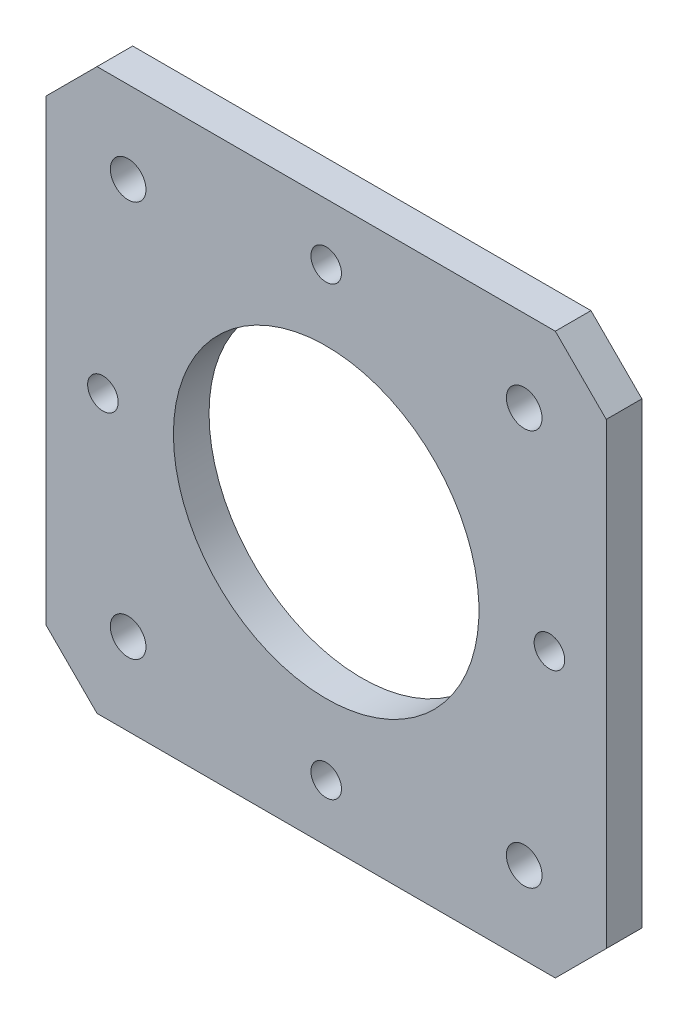
ISO-10303-21;
HEADER;
FILE_DESCRIPTION(('STEP AP214'),'2;1');
FILE_NAME('part.step','',(''),(''),'','','');
FILE_SCHEMA(('AUTOMOTIVE_DESIGN { 1 0 10303 214 1 1 1 1 }'));
ENDSEC;
DATA;
#1=APPLICATION_CONTEXT('core data for automotive mechanical design processes');
#2=APPLICATION_PROTOCOL_DEFINITION('international standard','automotive_design',2000,#1);
#3=PRODUCT_CONTEXT('',#1,'mechanical');
#4=PRODUCT('Part','Part','',(#3));
#5=PRODUCT_RELATED_PRODUCT_CATEGORY('part','',(#4));
#6=PRODUCT_DEFINITION_FORMATION('','',#4);
#7=PRODUCT_DEFINITION_CONTEXT('part definition',#1,'design');
#8=PRODUCT_DEFINITION('design','',#6,#7);
#9=PRODUCT_DEFINITION_SHAPE('','',#8);
#10=(LENGTH_UNIT() NAMED_UNIT(*) SI_UNIT(.MILLI.,.METRE.));
#11=(NAMED_UNIT(*) PLANE_ANGLE_UNIT() SI_UNIT($,.RADIAN.));
#12=(NAMED_UNIT(*) SI_UNIT($,.STERADIAN.) SOLID_ANGLE_UNIT());
#13=UNCERTAINTY_MEASURE_WITH_UNIT(LENGTH_MEASURE(1.E-05),#10,'distance_accuracy_value','');
#14=(GEOMETRIC_REPRESENTATION_CONTEXT(3) GLOBAL_UNCERTAINTY_ASSIGNED_CONTEXT((#13)) GLOBAL_UNIT_ASSIGNED_CONTEXT((#10,
#11,#12)) REPRESENTATION_CONTEXT('',''));
#15=CARTESIAN_POINT('',(0.,0.,0.));
#16=DIRECTION('',(0.,0.,1.));
#17=DIRECTION('',(1.,0.,0.));
#18=AXIS2_PLACEMENT_3D('',#15,#16,#17);
#19=CARTESIAN_POINT('',(0.,0.,3.5));
#20=DIRECTION('',(0.,0.,1.));
#21=DIRECTION('',(1.,0.,0.));
#22=AXIS2_PLACEMENT_3D('',#19,#20,#21);
#23=PLANE('',#22);
#24=CARTESIAN_POINT('',(0.,21.920310216783,3.5));
#25=DIRECTION('',(0.,0.,-1.));
#26=DIRECTION('',(-1.,0.,0.));
#27=AXIS2_PLACEMENT_3D('',#24,#25,#26);
#28=CIRCLE('',#27,1.5);
#29=CARTESIAN_POINT('',(-1.5,21.920310216783,3.5));
#30=VERTEX_POINT('',#29);
#31=EDGE_CURVE('E237',#30,#30,#28,.T.);
#32=ORIENTED_EDGE('',*,*,#31,.T.);
#33=EDGE_LOOP('',(#32));
#34=FACE_BOUND('',#33,.T.);
#35=CARTESIAN_POINT('',(21.920310216783,0.,3.5));
#36=DIRECTION('',(0.,0.,-1.));
#37=DIRECTION('',(-1.,0.,0.));
#38=AXIS2_PLACEMENT_3D('',#35,#36,#37);
#39=CIRCLE('',#38,1.5);
#40=CARTESIAN_POINT('',(20.420310216783,0.,3.5));
#41=VERTEX_POINT('',#40);
#42=EDGE_CURVE('E257',#41,#41,#39,.T.);
#43=ORIENTED_EDGE('',*,*,#42,.T.);
#44=EDGE_LOOP('',(#43));
#45=FACE_BOUND('',#44,.T.);
#46=CARTESIAN_POINT('',(0.,-21.920310216783,3.5));
#47=DIRECTION('',(0.,0.,-1.));
#48=DIRECTION('',(-1.,0.,0.));
#49=AXIS2_PLACEMENT_3D('',#46,#47,#48);
#50=CIRCLE('',#49,1.5);
#51=CARTESIAN_POINT('',(-1.5,-21.920310216783,3.5));
#52=VERTEX_POINT('',#51);
#53=EDGE_CURVE('E249',#52,#52,#50,.T.);
#54=ORIENTED_EDGE('',*,*,#53,.T.);
#55=EDGE_LOOP('',(#54));
#56=FACE_BOUND('',#55,.T.);
#57=CARTESIAN_POINT('',(-21.920310216783,0.,3.5));
#58=DIRECTION('',(0.,0.,-1.));
#59=DIRECTION('',(-1.,0.,0.));
#60=AXIS2_PLACEMENT_3D('',#57,#58,#59);
#61=CIRCLE('',#60,1.5);
#62=CARTESIAN_POINT('',(-23.420310216783,0.,3.5));
#63=VERTEX_POINT('',#62);
#64=EDGE_CURVE('E241',#63,#63,#61,.T.);
#65=ORIENTED_EDGE('',*,*,#64,.T.);
#66=EDGE_LOOP('',(#65));
#67=FACE_BOUND('',#66,.T.);
#68=CARTESIAN_POINT('',(0.,0.,3.5));
#69=DIRECTION('',(0.,0.,-1.));
#70=DIRECTION('',(-1.,0.,0.));
#71=AXIS2_PLACEMENT_3D('',#68,#69,#70);
#72=CIRCLE('',#71,15.);
#73=CARTESIAN_POINT('',(-15.,0.,3.5));
#74=VERTEX_POINT('',#73);
#75=EDGE_CURVE('E229',#74,#74,#72,.T.);
#76=ORIENTED_EDGE('',*,*,#75,.T.);
#77=EDGE_LOOP('',(#76));
#78=FACE_BOUND('',#77,.T.);
#79=CARTESIAN_POINT('',(-19.4454364826301,-19.4454364826301,3.5));
#80=DIRECTION('',(0.,0.,1.));
#81=DIRECTION('',(1.,0.,0.));
#82=AXIS2_PLACEMENT_3D('',#79,#80,#81);
#83=CIRCLE('',#82,1.75);
#84=CARTESIAN_POINT('',(-17.6954364826301,-19.4454364826301,3.5));
#85=VERTEX_POINT('',#84);
#86=EDGE_CURVE('E213',#85,#85,#83,.T.);
#87=ORIENTED_EDGE('',*,*,#86,.F.);
#88=EDGE_LOOP('',(#87));
#89=FACE_BOUND('',#88,.T.);
#90=CARTESIAN_POINT('',(19.4454364826301,19.4454364826301,3.5));
#91=DIRECTION('',(0.,0.,1.));
#92=DIRECTION('',(1.,0.,0.));
#93=AXIS2_PLACEMENT_3D('',#90,#91,#92);
#94=CIRCLE('',#93,1.75);
#95=CARTESIAN_POINT('',(21.1954364826301,19.4454364826301,3.5));
#96=VERTEX_POINT('',#95);
#97=EDGE_CURVE('E190',#96,#96,#94,.T.);
#98=ORIENTED_EDGE('',*,*,#97,.F.);
#99=EDGE_LOOP('',(#98));
#100=FACE_BOUND('',#99,.T.);
#101=DIRECTION('',(0.,-1.,0.));
#102=VECTOR('',#101,1.);
#103=CARTESIAN_POINT('',(-27.5,27.5,3.5));
#104=LINE('',#103,#102);
#105=CARTESIAN_POINT('',(-27.5,22.5,3.5));
#106=VERTEX_POINT('',#105);
#107=CARTESIAN_POINT('',(-27.5,-22.5,3.5));
#108=VERTEX_POINT('',#107);
#109=EDGE_CURVE('E195',#106,#108,#104,.T.);
#110=ORIENTED_EDGE('',*,*,#109,.T.);
#111=DIRECTION('',(-0.707106781186546,0.707106781186549,0.));
#112=VECTOR('',#111,1.);
#113=CARTESIAN_POINT('',(-25.,-24.9999999999999,3.5));
#114=LINE('',#113,#112);
#115=CARTESIAN_POINT('',(-22.5,-27.5,3.5));
#116=VERTEX_POINT('',#115);
#117=EDGE_CURVE('E171',#108,#116,#114,.F.);
#118=ORIENTED_EDGE('',*,*,#117,.T.);
#119=DIRECTION('',(1.,0.,0.));
#120=VECTOR('',#119,1.);
#121=CARTESIAN_POINT('',(-27.5,-27.5,3.5));
#122=LINE('',#121,#120);
#123=CARTESIAN_POINT('',(22.5,-27.5,3.5));
#124=VERTEX_POINT('',#123);
#125=EDGE_CURVE('E129',#116,#124,#122,.T.);
#126=ORIENTED_EDGE('',*,*,#125,.T.);
#127=DIRECTION('',(-0.707106781186549,-0.707106781186546,0.));
#128=VECTOR('',#127,1.);
#129=CARTESIAN_POINT('',(24.9999999999999,-25.0000000000001,3.5));
#130=LINE('',#129,#128);
#131=CARTESIAN_POINT('',(27.5,-22.5,3.5));
#132=VERTEX_POINT('',#131);
#133=EDGE_CURVE('E168',#124,#132,#130,.F.);
#134=ORIENTED_EDGE('',*,*,#133,.T.);
#135=DIRECTION('',(0.,1.,0.));
#136=VECTOR('',#135,1.);
#137=CARTESIAN_POINT('',(27.5,27.5,3.5));
#138=LINE('',#137,#136);
#139=CARTESIAN_POINT('',(27.5,22.5,3.5));
#140=VERTEX_POINT('',#139);
#141=EDGE_CURVE('E138',#132,#140,#138,.T.);
#142=ORIENTED_EDGE('',*,*,#141,.T.);
#143=DIRECTION('',(0.707106781186546,-0.707106781186549,0.));
#144=VECTOR('',#143,1.);
#145=CARTESIAN_POINT('',(25.0000000000001,24.9999999999999,3.5));
#146=LINE('',#145,#144);
#147=CARTESIAN_POINT('',(22.5,27.5,3.5));
#148=VERTEX_POINT('',#147);
#149=EDGE_CURVE('E63',#140,#148,#146,.F.);
#150=ORIENTED_EDGE('',*,*,#149,.T.);
#151=DIRECTION('',(-1.,0.,0.));
#152=VECTOR('',#151,1.);
#153=CARTESIAN_POINT('',(-27.5,27.5,3.5));
#154=LINE('',#153,#152);
#155=CARTESIAN_POINT('',(-22.5,27.5,3.5));
#156=VERTEX_POINT('',#155);
#157=EDGE_CURVE('E143',#148,#156,#154,.T.);
#158=ORIENTED_EDGE('',*,*,#157,.T.);
#159=DIRECTION('',(0.707106781186549,0.707106781186547,0.));
#160=VECTOR('',#159,1.);
#161=CARTESIAN_POINT('',(-25.,25.,3.5));
#162=LINE('',#161,#160);
#163=EDGE_CURVE('E165',#156,#106,#162,.F.);
#164=ORIENTED_EDGE('',*,*,#163,.T.);
#165=EDGE_LOOP('',(#110,#118,#126,#134,#142,#150,#158,#164));
#166=FACE_BOUND('',#165,.T.);
#167=CARTESIAN_POINT('',(-19.4454364826301,19.4454364826301,3.5));
#168=DIRECTION('',(0.,0.,1.));
#169=DIRECTION('',(1.,0.,0.));
#170=AXIS2_PLACEMENT_3D('',#167,#168,#169);
#171=CIRCLE('',#170,1.75);
#172=CARTESIAN_POINT('',(-17.6954364826301,19.4454364826301,3.5));
#173=VERTEX_POINT('',#172);
#174=EDGE_CURVE('E205',#173,#173,#171,.T.);
#175=ORIENTED_EDGE('',*,*,#174,.F.);
#176=EDGE_LOOP('',(#175));
#177=FACE_BOUND('',#176,.T.);
#178=CARTESIAN_POINT('',(19.4454364826301,-19.4454364826301,3.5));
#179=DIRECTION('',(0.,0.,1.));
#180=DIRECTION('',(1.,0.,0.));
#181=AXIS2_PLACEMENT_3D('',#178,#179,#180);
#182=CIRCLE('',#181,1.75);
#183=CARTESIAN_POINT('',(21.1954364826301,-19.4454364826301,3.5));
#184=VERTEX_POINT('',#183);
#185=EDGE_CURVE('E221',#184,#184,#182,.T.);
#186=ORIENTED_EDGE('',*,*,#185,.F.);
#187=EDGE_LOOP('',(#186));
#188=FACE_BOUND('',#187,.T.);
#189=ADVANCED_FACE('F41',(#34,#45,#56,#67,#78,#89,#100,#166,#177,#188),#23,.T.);
#190=CARTESIAN_POINT('',(0.,0.,0.));
#191=DIRECTION('',(0.,0.,1.));
#192=DIRECTION('',(1.,0.,0.));
#193=AXIS2_PLACEMENT_3D('',#190,#191,#192);
#194=PLANE('',#193);
#195=CARTESIAN_POINT('',(0.,21.920310216783,0.));
#196=DIRECTION('',(0.,0.,-1.));
#197=DIRECTION('',(-1.,0.,0.));
#198=AXIS2_PLACEMENT_3D('',#195,#196,#197);
#199=CIRCLE('',#198,1.5);
#200=CARTESIAN_POINT('',(-1.5,21.920310216783,0.));
#201=VERTEX_POINT('',#200);
#202=EDGE_CURVE('E265',#201,#201,#199,.T.);
#203=ORIENTED_EDGE('',*,*,#202,.F.);
#204=EDGE_LOOP('',(#203));
#205=FACE_BOUND('',#204,.T.);
#206=CARTESIAN_POINT('',(21.920310216783,0.,0.));
#207=DIRECTION('',(0.,0.,-1.));
#208=DIRECTION('',(-1.,0.,0.));
#209=AXIS2_PLACEMENT_3D('',#206,#207,#208);
#210=CIRCLE('',#209,1.5);
#211=CARTESIAN_POINT('',(20.420310216783,0.,0.));
#212=VERTEX_POINT('',#211);
#213=EDGE_CURVE('E261',#212,#212,#210,.T.);
#214=ORIENTED_EDGE('',*,*,#213,.F.);
#215=EDGE_LOOP('',(#214));
#216=FACE_BOUND('',#215,.T.);
#217=CARTESIAN_POINT('',(0.,-21.920310216783,0.));
#218=DIRECTION('',(0.,0.,-1.));
#219=DIRECTION('',(-1.,0.,0.));
#220=AXIS2_PLACEMENT_3D('',#217,#218,#219);
#221=CIRCLE('',#220,1.5);
#222=CARTESIAN_POINT('',(-1.5,-21.920310216783,0.));
#223=VERTEX_POINT('',#222);
#224=EDGE_CURVE('E253',#223,#223,#221,.T.);
#225=ORIENTED_EDGE('',*,*,#224,.F.);
#226=EDGE_LOOP('',(#225));
#227=FACE_BOUND('',#226,.T.);
#228=CARTESIAN_POINT('',(-21.920310216783,0.,0.));
#229=DIRECTION('',(0.,0.,-1.));
#230=DIRECTION('',(-1.,0.,0.));
#231=AXIS2_PLACEMENT_3D('',#228,#229,#230);
#232=CIRCLE('',#231,1.5);
#233=CARTESIAN_POINT('',(-23.420310216783,0.,0.));
#234=VERTEX_POINT('',#233);
#235=EDGE_CURVE('E245',#234,#234,#232,.T.);
#236=ORIENTED_EDGE('',*,*,#235,.F.);
#237=EDGE_LOOP('',(#236));
#238=FACE_BOUND('',#237,.T.);
#239=CARTESIAN_POINT('',(0.,0.,0.));
#240=DIRECTION('',(0.,0.,-1.));
#241=DIRECTION('',(-1.,0.,0.));
#242=AXIS2_PLACEMENT_3D('',#239,#240,#241);
#243=CIRCLE('',#242,15.);
#244=CARTESIAN_POINT('',(-15.,0.,0.));
#245=VERTEX_POINT('',#244);
#246=EDGE_CURVE('E233',#245,#245,#243,.T.);
#247=ORIENTED_EDGE('',*,*,#246,.F.);
#248=EDGE_LOOP('',(#247));
#249=FACE_BOUND('',#248,.T.);
#250=DIRECTION('',(1.,0.,0.));
#251=VECTOR('',#250,1.);
#252=CARTESIAN_POINT('',(-27.5,-27.5,0.));
#253=LINE('',#252,#251);
#254=CARTESIAN_POINT('',(-22.5,-27.5,0.));
#255=VERTEX_POINT('',#254);
#256=CARTESIAN_POINT('',(22.5,-27.5,0.));
#257=VERTEX_POINT('',#256);
#258=EDGE_CURVE('E126',#255,#257,#253,.T.);
#259=ORIENTED_EDGE('',*,*,#258,.F.);
#260=DIRECTION('',(0.707106781186546,-0.707106781186549,0.));
#261=VECTOR('',#260,1.);
#262=CARTESIAN_POINT('',(-22.5,-27.5,0.));
#263=LINE('',#262,#261);
#264=CARTESIAN_POINT('',(-27.5,-22.5,0.));
#265=VERTEX_POINT('',#264);
#266=EDGE_CURVE('E108',#255,#265,#263,.F.);
#267=ORIENTED_EDGE('',*,*,#266,.T.);
#268=DIRECTION('',(0.,-1.,0.));
#269=VECTOR('',#268,1.);
#270=CARTESIAN_POINT('',(-27.5,27.5,0.));
#271=LINE('',#270,#269);
#272=CARTESIAN_POINT('',(-27.5,22.5,0.));
#273=VERTEX_POINT('',#272);
#274=EDGE_CURVE('E139',#273,#265,#271,.T.);
#275=ORIENTED_EDGE('',*,*,#274,.F.);
#276=DIRECTION('',(-0.707106781186549,-0.707106781186547,0.));
#277=VECTOR('',#276,1.);
#278=CARTESIAN_POINT('',(-27.5,22.5,0.));
#279=LINE('',#278,#277);
#280=CARTESIAN_POINT('',(-22.5,27.5,0.));
#281=VERTEX_POINT('',#280);
#282=EDGE_CURVE('E153',#273,#281,#279,.F.);
#283=ORIENTED_EDGE('',*,*,#282,.T.);
#284=DIRECTION('',(-1.,0.,0.));
#285=VECTOR('',#284,1.);
#286=CARTESIAN_POINT('',(-27.5,27.5,0.));
#287=LINE('',#286,#285);
#288=CARTESIAN_POINT('',(22.5,27.5,0.));
#289=VERTEX_POINT('',#288);
#290=EDGE_CURVE('E145',#289,#281,#287,.T.);
#291=ORIENTED_EDGE('',*,*,#290,.F.);
#292=DIRECTION('',(-0.707106781186546,0.707106781186549,0.));
#293=VECTOR('',#292,1.);
#294=CARTESIAN_POINT('',(22.5,27.5,0.));
#295=LINE('',#294,#293);
#296=CARTESIAN_POINT('',(27.5,22.5,0.));
#297=VERTEX_POINT('',#296);
#298=EDGE_CURVE('E131',#289,#297,#295,.F.);
#299=ORIENTED_EDGE('',*,*,#298,.T.);
#300=DIRECTION('',(0.,1.,0.));
#301=VECTOR('',#300,1.);
#302=CARTESIAN_POINT('',(27.5,27.5,0.));
#303=LINE('',#302,#301);
#304=CARTESIAN_POINT('',(27.5,-22.5,0.));
#305=VERTEX_POINT('',#304);
#306=EDGE_CURVE('E188',#305,#297,#303,.T.);
#307=ORIENTED_EDGE('',*,*,#306,.F.);
#308=DIRECTION('',(0.707106781186549,0.707106781186546,0.));
#309=VECTOR('',#308,1.);
#310=CARTESIAN_POINT('',(27.5,-22.5,0.));
#311=LINE('',#310,#309);
#312=EDGE_CURVE('E120',#305,#257,#311,.F.);
#313=ORIENTED_EDGE('',*,*,#312,.T.);
#314=EDGE_LOOP('',(#259,#267,#275,#283,#291,#299,#307,#313));
#315=FACE_BOUND('',#314,.T.);
#316=CARTESIAN_POINT('',(19.4454364826301,19.4454364826301,0.));
#317=DIRECTION('',(0.,0.,1.));
#318=DIRECTION('',(1.,0.,0.));
#319=AXIS2_PLACEMENT_3D('',#316,#317,#318);
#320=CIRCLE('',#319,1.75);
#321=CARTESIAN_POINT('',(21.1954364826301,19.4454364826301,0.));
#322=VERTEX_POINT('',#321);
#323=EDGE_CURVE('E201',#322,#322,#320,.T.);
#324=ORIENTED_EDGE('',*,*,#323,.T.);
#325=EDGE_LOOP('',(#324));
#326=FACE_BOUND('',#325,.T.);
#327=CARTESIAN_POINT('',(-19.4454364826301,19.4454364826301,0.));
#328=DIRECTION('',(0.,0.,1.));
#329=DIRECTION('',(1.,0.,0.));
#330=AXIS2_PLACEMENT_3D('',#327,#328,#329);
#331=CIRCLE('',#330,1.75);
#332=CARTESIAN_POINT('',(-17.6954364826301,19.4454364826301,0.));
#333=VERTEX_POINT('',#332);
#334=EDGE_CURVE('E209',#333,#333,#331,.T.);
#335=ORIENTED_EDGE('',*,*,#334,.T.);
#336=EDGE_LOOP('',(#335));
#337=FACE_BOUND('',#336,.T.);
#338=CARTESIAN_POINT('',(-19.4454364826301,-19.4454364826301,0.));
#339=DIRECTION('',(0.,0.,1.));
#340=DIRECTION('',(1.,0.,0.));
#341=AXIS2_PLACEMENT_3D('',#338,#339,#340);
#342=CIRCLE('',#341,1.75);
#343=CARTESIAN_POINT('',(-17.6954364826301,-19.4454364826301,0.));
#344=VERTEX_POINT('',#343);
#345=EDGE_CURVE('E217',#344,#344,#342,.T.);
#346=ORIENTED_EDGE('',*,*,#345,.T.);
#347=EDGE_LOOP('',(#346));
#348=FACE_BOUND('',#347,.T.);
#349=CARTESIAN_POINT('',(19.4454364826301,-19.4454364826301,0.));
#350=DIRECTION('',(0.,0.,1.));
#351=DIRECTION('',(1.,0.,0.));
#352=AXIS2_PLACEMENT_3D('',#349,#350,#351);
#353=CIRCLE('',#352,1.75);
#354=CARTESIAN_POINT('',(21.1954364826301,-19.4454364826301,0.));
#355=VERTEX_POINT('',#354);
#356=EDGE_CURVE('E225',#355,#355,#353,.T.);
#357=ORIENTED_EDGE('',*,*,#356,.T.);
#358=EDGE_LOOP('',(#357));
#359=FACE_BOUND('',#358,.T.);
#360=ADVANCED_FACE('F134',(#205,#216,#227,#238,#249,#315,#326,#337,#348,#359),#194,.F.);
#361=CARTESIAN_POINT('',(27.5,27.5,3.5));
#362=DIRECTION('',(-1.,0.,0.));
#363=DIRECTION('',(0.,-1.,0.));
#364=AXIS2_PLACEMENT_3D('',#361,#362,#363);
#365=PLANE('',#364);
#366=ORIENTED_EDGE('',*,*,#141,.F.);
#367=DIRECTION('',(0.,0.,-1.));
#368=VECTOR('',#367,1.);
#369=CARTESIAN_POINT('',(27.5,-22.5,3.5));
#370=LINE('',#369,#368);
#371=EDGE_CURVE('E177',#132,#305,#370,.T.);
#372=ORIENTED_EDGE('',*,*,#371,.T.);
#373=ORIENTED_EDGE('',*,*,#306,.T.);
#374=DIRECTION('',(0.,0.,1.));
#375=VECTOR('',#374,1.);
#376=CARTESIAN_POINT('',(27.5,22.5,3.5));
#377=LINE('',#376,#375);
#378=EDGE_CURVE('E174',#297,#140,#377,.T.);
#379=ORIENTED_EDGE('',*,*,#378,.T.);
#380=EDGE_LOOP('',(#366,#372,#373,#379));
#381=FACE_BOUND('',#380,.T.);
#382=ADVANCED_FACE('F284',(#381),#365,.F.);
#383=CARTESIAN_POINT('',(-27.5,27.5,3.5));
#384=DIRECTION('',(0.,-1.,0.));
#385=DIRECTION('',(1.,0.,0.));
#386=AXIS2_PLACEMENT_3D('',#383,#384,#385);
#387=PLANE('',#386);
#388=ORIENTED_EDGE('',*,*,#290,.T.);
#389=DIRECTION('',(0.,0.,1.));
#390=VECTOR('',#389,1.);
#391=CARTESIAN_POINT('',(-22.5,27.5,3.5));
#392=LINE('',#391,#390);
#393=EDGE_CURVE('E11',#281,#156,#392,.T.);
#394=ORIENTED_EDGE('',*,*,#393,.T.);
#395=ORIENTED_EDGE('',*,*,#157,.F.);
#396=DIRECTION('',(0.,0.,-1.));
#397=VECTOR('',#396,1.);
#398=CARTESIAN_POINT('',(22.5,27.5,3.5));
#399=LINE('',#398,#397);
#400=EDGE_CURVE('E51',#148,#289,#399,.T.);
#401=ORIENTED_EDGE('',*,*,#400,.T.);
#402=EDGE_LOOP('',(#388,#394,#395,#401));
#403=FACE_BOUND('',#402,.T.);
#404=ADVANCED_FACE('F184',(#403),#387,.F.);
#405=CARTESIAN_POINT('',(-27.5,27.5,3.5));
#406=DIRECTION('',(1.,0.,0.));
#407=DIRECTION('',(0.,0.,-1.));
#408=AXIS2_PLACEMENT_3D('',#405,#406,#407);
#409=PLANE('',#408);
#410=ORIENTED_EDGE('',*,*,#274,.T.);
#411=DIRECTION('',(0.,0.,1.));
#412=VECTOR('',#411,1.);
#413=CARTESIAN_POINT('',(-27.5,-22.5,3.5));
#414=LINE('',#413,#412);
#415=EDGE_CURVE('E113',#265,#108,#414,.T.);
#416=ORIENTED_EDGE('',*,*,#415,.T.);
#417=ORIENTED_EDGE('',*,*,#109,.F.);
#418=DIRECTION('',(0.,0.,-1.));
#419=VECTOR('',#418,1.);
#420=CARTESIAN_POINT('',(-27.5,22.5,3.5));
#421=LINE('',#420,#419);
#422=EDGE_CURVE('E119',#106,#273,#421,.T.);
#423=ORIENTED_EDGE('',*,*,#422,.T.);
#424=EDGE_LOOP('',(#410,#416,#417,#423));
#425=FACE_BOUND('',#424,.T.);
#426=ADVANCED_FACE('F321',(#425),#409,.F.);
#427=CARTESIAN_POINT('',(-27.5,-27.5,3.5));
#428=DIRECTION('',(0.,1.,0.));
#429=DIRECTION('',(0.,0.,1.));
#430=AXIS2_PLACEMENT_3D('',#427,#428,#429);
#431=PLANE('',#430);
#432=ORIENTED_EDGE('',*,*,#125,.F.);
#433=DIRECTION('',(0.,0.,-1.));
#434=VECTOR('',#433,1.);
#435=CARTESIAN_POINT('',(-22.5,-27.5,3.5));
#436=LINE('',#435,#434);
#437=EDGE_CURVE('E112',#116,#255,#436,.T.);
#438=ORIENTED_EDGE('',*,*,#437,.T.);
#439=ORIENTED_EDGE('',*,*,#258,.T.);
#440=DIRECTION('',(0.,0.,1.));
#441=VECTOR('',#440,1.);
#442=CARTESIAN_POINT('',(22.5,-27.5,3.5));
#443=LINE('',#442,#441);
#444=EDGE_CURVE('E132',#257,#124,#443,.T.);
#445=ORIENTED_EDGE('',*,*,#444,.T.);
#446=EDGE_LOOP('',(#432,#438,#439,#445));
#447=FACE_BOUND('',#446,.T.);
#448=ADVANCED_FACE('F125',(#447),#431,.F.);
#449=CARTESIAN_POINT('',(19.4454364826301,19.4454364826301,3.5));
#450=DIRECTION('',(0.,0.,-1.));
#451=DIRECTION('',(-1.,0.,0.));
#452=AXIS2_PLACEMENT_3D('',#449,#450,#451);
#453=CYLINDRICAL_SURFACE('',#452,1.75);
#454=ORIENTED_EDGE('',*,*,#97,.T.);
#455=EDGE_LOOP('',(#454));
#456=FACE_BOUND('',#455,.T.);
#457=ORIENTED_EDGE('',*,*,#323,.F.);
#458=EDGE_LOOP('',(#457));
#459=FACE_BOUND('',#458,.T.);
#460=ADVANCED_FACE('F316',(#456,#459),#453,.F.);
#461=CARTESIAN_POINT('',(-19.4454364826301,19.4454364826301,3.5));
#462=DIRECTION('',(0.,0.,-1.));
#463=DIRECTION('',(-1.,0.,0.));
#464=AXIS2_PLACEMENT_3D('',#461,#462,#463);
#465=CYLINDRICAL_SURFACE('',#464,1.75);
#466=ORIENTED_EDGE('',*,*,#174,.T.);
#467=EDGE_LOOP('',(#466));
#468=FACE_BOUND('',#467,.T.);
#469=ORIENTED_EDGE('',*,*,#334,.F.);
#470=EDGE_LOOP('',(#469));
#471=FACE_BOUND('',#470,.T.);
#472=ADVANCED_FACE('F365',(#468,#471),#465,.F.);
#473=CARTESIAN_POINT('',(-19.4454364826301,-19.4454364826301,3.5));
#474=DIRECTION('',(0.,0.,-1.));
#475=DIRECTION('',(-1.,0.,0.));
#476=AXIS2_PLACEMENT_3D('',#473,#474,#475);
#477=CYLINDRICAL_SURFACE('',#476,1.75);
#478=ORIENTED_EDGE('',*,*,#86,.T.);
#479=EDGE_LOOP('',(#478));
#480=FACE_BOUND('',#479,.T.);
#481=ORIENTED_EDGE('',*,*,#345,.F.);
#482=EDGE_LOOP('',(#481));
#483=FACE_BOUND('',#482,.T.);
#484=ADVANCED_FACE('F307',(#480,#483),#477,.F.);
#485=CARTESIAN_POINT('',(19.4454364826301,-19.4454364826301,3.5));
#486=DIRECTION('',(0.,0.,-1.));
#487=DIRECTION('',(-1.,0.,0.));
#488=AXIS2_PLACEMENT_3D('',#485,#486,#487);
#489=CYLINDRICAL_SURFACE('',#488,1.75);
#490=ORIENTED_EDGE('',*,*,#185,.T.);
#491=EDGE_LOOP('',(#490));
#492=FACE_BOUND('',#491,.T.);
#493=ORIENTED_EDGE('',*,*,#356,.F.);
#494=EDGE_LOOP('',(#493));
#495=FACE_BOUND('',#494,.T.);
#496=ADVANCED_FACE('F297',(#492,#495),#489,.F.);
#497=CARTESIAN_POINT('',(0.,0.,3.5));
#498=DIRECTION('',(0.,0.,-1.));
#499=DIRECTION('',(-1.,0.,0.));
#500=AXIS2_PLACEMENT_3D('',#497,#498,#499);
#501=CYLINDRICAL_SURFACE('',#500,15.);
#502=ORIENTED_EDGE('',*,*,#75,.F.);
#503=EDGE_LOOP('',(#502));
#504=FACE_BOUND('',#503,.T.);
#505=ORIENTED_EDGE('',*,*,#246,.T.);
#506=EDGE_LOOP('',(#505));
#507=FACE_BOUND('',#506,.T.);
#508=ADVANCED_FACE('F294',(#504,#507),#501,.F.);
#509=CARTESIAN_POINT('',(-21.920310216783,0.,3.5));
#510=DIRECTION('',(0.,0.,-1.));
#511=DIRECTION('',(-1.,0.,0.));
#512=AXIS2_PLACEMENT_3D('',#509,#510,#511);
#513=CYLINDRICAL_SURFACE('',#512,1.5);
#514=ORIENTED_EDGE('',*,*,#64,.F.);
#515=EDGE_LOOP('',(#514));
#516=FACE_BOUND('',#515,.T.);
#517=ORIENTED_EDGE('',*,*,#235,.T.);
#518=EDGE_LOOP('',(#517));
#519=FACE_BOUND('',#518,.T.);
#520=ADVANCED_FACE('F296',(#516,#519),#513,.F.);
#521=CARTESIAN_POINT('',(0.,-21.920310216783,3.5));
#522=DIRECTION('',(0.,0.,-1.));
#523=DIRECTION('',(-1.,0.,0.));
#524=AXIS2_PLACEMENT_3D('',#521,#522,#523);
#525=CYLINDRICAL_SURFACE('',#524,1.5);
#526=ORIENTED_EDGE('',*,*,#53,.F.);
#527=EDGE_LOOP('',(#526));
#528=FACE_BOUND('',#527,.T.);
#529=ORIENTED_EDGE('',*,*,#224,.T.);
#530=EDGE_LOOP('',(#529));
#531=FACE_BOUND('',#530,.T.);
#532=ADVANCED_FACE('F304',(#528,#531),#525,.F.);
#533=CARTESIAN_POINT('',(21.920310216783,0.,3.5));
#534=DIRECTION('',(0.,0.,-1.));
#535=DIRECTION('',(-1.,0.,0.));
#536=AXIS2_PLACEMENT_3D('',#533,#534,#535);
#537=CYLINDRICAL_SURFACE('',#536,1.5);
#538=ORIENTED_EDGE('',*,*,#42,.F.);
#539=EDGE_LOOP('',(#538));
#540=FACE_BOUND('',#539,.T.);
#541=ORIENTED_EDGE('',*,*,#213,.T.);
#542=EDGE_LOOP('',(#541));
#543=FACE_BOUND('',#542,.T.);
#544=ADVANCED_FACE('F278',(#540,#543),#537,.F.);
#545=CARTESIAN_POINT('',(0.,21.920310216783,3.5));
#546=DIRECTION('',(0.,0.,-1.));
#547=DIRECTION('',(-1.,0.,0.));
#548=AXIS2_PLACEMENT_3D('',#545,#546,#547);
#549=CYLINDRICAL_SURFACE('',#548,1.5);
#550=ORIENTED_EDGE('',*,*,#31,.F.);
#551=EDGE_LOOP('',(#550));
#552=FACE_BOUND('',#551,.T.);
#553=ORIENTED_EDGE('',*,*,#202,.T.);
#554=EDGE_LOOP('',(#553));
#555=FACE_BOUND('',#554,.T.);
#556=ADVANCED_FACE('F275',(#552,#555),#549,.F.);
#557=CARTESIAN_POINT('',(-22.5,-27.5,3.5));
#558=DIRECTION('',(0.707106781186549,0.707106781186546,0.));
#559=DIRECTION('',(0.,0.,-1.));
#560=AXIS2_PLACEMENT_3D('',#557,#558,#559);
#561=PLANE('',#560);
#562=ORIENTED_EDGE('',*,*,#117,.F.);
#563=ORIENTED_EDGE('',*,*,#415,.F.);
#564=ORIENTED_EDGE('',*,*,#266,.F.);
#565=ORIENTED_EDGE('',*,*,#437,.F.);
#566=EDGE_LOOP('',(#562,#563,#564,#565));
#567=FACE_BOUND('',#566,.T.);
#568=ADVANCED_FACE('F111',(#567),#561,.F.);
#569=CARTESIAN_POINT('',(27.5,-22.5,3.5));
#570=DIRECTION('',(-0.707106781186546,0.707106781186549,0.));
#571=DIRECTION('',(0.,0.,-1.));
#572=AXIS2_PLACEMENT_3D('',#569,#570,#571);
#573=PLANE('',#572);
#574=ORIENTED_EDGE('',*,*,#133,.F.);
#575=ORIENTED_EDGE('',*,*,#444,.F.);
#576=ORIENTED_EDGE('',*,*,#312,.F.);
#577=ORIENTED_EDGE('',*,*,#371,.F.);
#578=EDGE_LOOP('',(#574,#575,#576,#577));
#579=FACE_BOUND('',#578,.T.);
#580=ADVANCED_FACE('F336',(#579),#573,.F.);
#581=CARTESIAN_POINT('',(-27.5,22.5,3.5));
#582=DIRECTION('',(0.707106781186546,-0.707106781186548,0.));
#583=DIRECTION('',(0.,0.,-1.));
#584=AXIS2_PLACEMENT_3D('',#581,#582,#583);
#585=PLANE('',#584);
#586=ORIENTED_EDGE('',*,*,#163,.F.);
#587=ORIENTED_EDGE('',*,*,#393,.F.);
#588=ORIENTED_EDGE('',*,*,#282,.F.);
#589=ORIENTED_EDGE('',*,*,#422,.F.);
#590=EDGE_LOOP('',(#586,#587,#588,#589));
#591=FACE_BOUND('',#590,.T.);
#592=ADVANCED_FACE('F341',(#591),#585,.F.);
#593=CARTESIAN_POINT('',(22.5,27.5,3.5));
#594=DIRECTION('',(-0.707106781186549,-0.707106781186546,0.));
#595=DIRECTION('',(0.,0.,-1.));
#596=AXIS2_PLACEMENT_3D('',#593,#594,#595);
#597=PLANE('',#596);
#598=ORIENTED_EDGE('',*,*,#149,.F.);
#599=ORIENTED_EDGE('',*,*,#378,.F.);
#600=ORIENTED_EDGE('',*,*,#298,.F.);
#601=ORIENTED_EDGE('',*,*,#400,.F.);
#602=EDGE_LOOP('',(#598,#599,#600,#601));
#603=FACE_BOUND('',#602,.T.);
#604=ADVANCED_FACE('F44',(#603),#597,.F.);
#605=CLOSED_SHELL('',(#189,#360,#382,#404,#426,#448,#460,#472,#484,#496,#508,#520,#532,#544,
#556,#568,#580,#592,#604));
#606=MANIFOLD_SOLID_BREP('B2',#605);
#607=ADVANCED_BREP_SHAPE_REPRESENTATION('',(#18,#606),#14);
#608=SHAPE_DEFINITION_REPRESENTATION(#9,#607);
ENDSEC;
END-ISO-10303-21;
